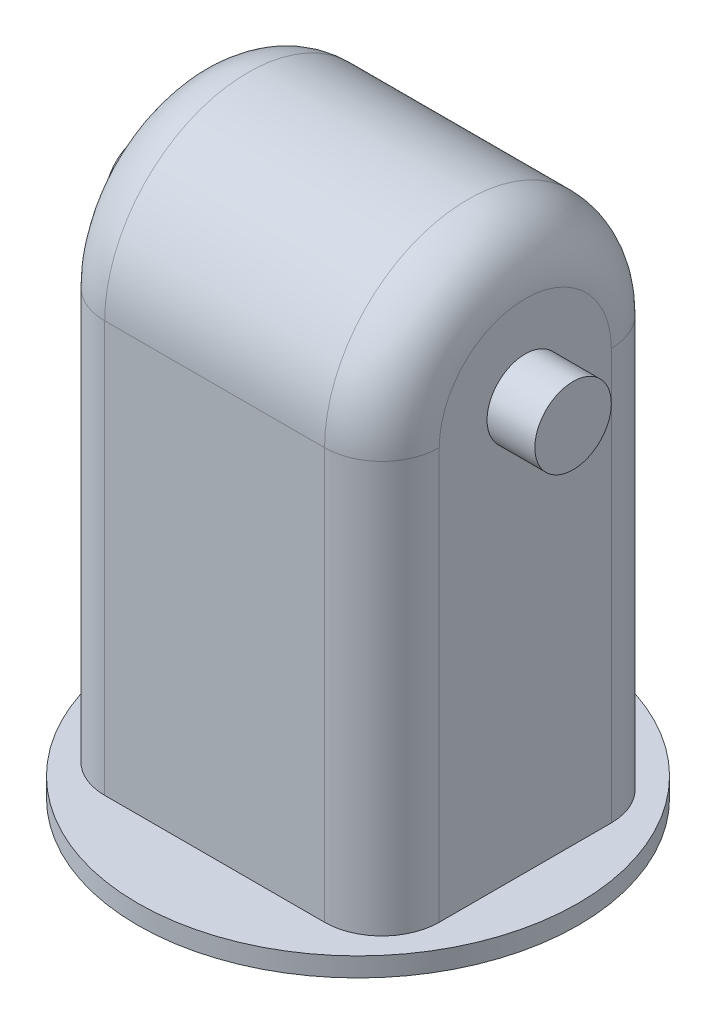
ISO-10303-21;
HEADER;
FILE_DESCRIPTION(('STEP AP214'),'2;1');
FILE_NAME('part.step','',(''),(''),'','','');
FILE_SCHEMA(('AUTOMOTIVE_DESIGN { 1 0 10303 214 1 1 1 1 }'));
ENDSEC;
DATA;
#1=APPLICATION_CONTEXT('core data for automotive mechanical design processes');
#2=APPLICATION_PROTOCOL_DEFINITION('international standard','automotive_design',2000,#1);
#3=PRODUCT_CONTEXT('',#1,'mechanical');
#4=PRODUCT('Part','Part','',(#3));
#5=PRODUCT_RELATED_PRODUCT_CATEGORY('part','',(#4));
#6=PRODUCT_DEFINITION_FORMATION('','',#4);
#7=PRODUCT_DEFINITION_CONTEXT('part definition',#1,'design');
#8=PRODUCT_DEFINITION('design','',#6,#7);
#9=PRODUCT_DEFINITION_SHAPE('','',#8);
#10=(LENGTH_UNIT() NAMED_UNIT(*) SI_UNIT(.MILLI.,.METRE.));
#11=(NAMED_UNIT(*) PLANE_ANGLE_UNIT() SI_UNIT($,.RADIAN.));
#12=(NAMED_UNIT(*) SI_UNIT($,.STERADIAN.) SOLID_ANGLE_UNIT());
#13=UNCERTAINTY_MEASURE_WITH_UNIT(LENGTH_MEASURE(1.E-05),#10,'distance_accuracy_value','');
#14=(GEOMETRIC_REPRESENTATION_CONTEXT(3) GLOBAL_UNCERTAINTY_ASSIGNED_CONTEXT((#13)) GLOBAL_UNIT_ASSIGNED_CONTEXT((#10,
#11,#12)) REPRESENTATION_CONTEXT('',''));
#15=CARTESIAN_POINT('',(0.,0.,0.));
#16=DIRECTION('',(0.,0.,1.));
#17=DIRECTION('',(1.,0.,0.));
#18=AXIS2_PLACEMENT_3D('',#15,#16,#17);
#19=CARTESIAN_POINT('',(17.5,45.,0.));
#20=DIRECTION('',(1.,0.,0.));
#21=DIRECTION('',(0.,0.,-1.));
#22=AXIS2_PLACEMENT_3D('',#19,#20,#21);
#23=CYLINDRICAL_SURFACE('',#22,15.);
#24=DIRECTION('',(1.,0.,0.));
#25=VECTOR('',#24,1.);
#26=CARTESIAN_POINT('',(-17.5,45.,-15.));
#27=LINE('',#26,#25);
#28=CARTESIAN_POINT('',(-11.5,45.,-15.));
#29=VERTEX_POINT('',#28);
#30=CARTESIAN_POINT('',(11.5,45.,-15.));
#31=VERTEX_POINT('',#30);
#32=EDGE_CURVE('E157',#29,#31,#27,.T.);
#33=ORIENTED_EDGE('',*,*,#32,.F.);
#34=CARTESIAN_POINT('',(-11.5,45.,0.));
#35=DIRECTION('',(1.,0.,0.));
#36=DIRECTION('',(0.,0.,-1.));
#37=AXIS2_PLACEMENT_3D('',#34,#35,#36);
#38=CIRCLE('',#37,15.);
#39=CARTESIAN_POINT('',(-11.5,45.,15.));
#40=VERTEX_POINT('',#39);
#41=EDGE_CURVE('E169',#29,#40,#38,.T.);
#42=ORIENTED_EDGE('',*,*,#41,.T.);
#43=DIRECTION('',(1.,0.,0.));
#44=VECTOR('',#43,1.);
#45=CARTESIAN_POINT('',(-17.5,45.,15.));
#46=LINE('',#45,#44);
#47=CARTESIAN_POINT('',(11.5,45.,15.));
#48=VERTEX_POINT('',#47);
#49=EDGE_CURVE('E154',#48,#40,#46,.F.);
#50=ORIENTED_EDGE('',*,*,#49,.F.);
#51=CARTESIAN_POINT('',(11.5,45.,0.));
#52=DIRECTION('',(-1.,0.,0.));
#53=DIRECTION('',(0.,0.,1.));
#54=AXIS2_PLACEMENT_3D('',#51,#52,#53);
#55=CIRCLE('',#54,15.);
#56=EDGE_CURVE('E167',#48,#31,#55,.T.);
#57=ORIENTED_EDGE('',*,*,#56,.T.);
#58=EDGE_LOOP('',(#33,#42,#50,#57));
#59=FACE_BOUND('',#58,.T.);
#60=ADVANCED_FACE('F36',(#59),#23,.T.);
#61=CARTESIAN_POINT('',(17.5,60.,15.));
#62=DIRECTION('',(-1.,0.,0.));
#63=DIRECTION('',(0.,0.,1.));
#64=AXIS2_PLACEMENT_3D('',#61,#62,#63);
#65=PLANE('',#64);
#66=CARTESIAN_POINT('',(17.5,45.,0.));
#67=DIRECTION('',(-1.,0.,0.));
#68=DIRECTION('',(0.,0.,1.));
#69=AXIS2_PLACEMENT_3D('',#66,#67,#68);
#70=CIRCLE('',#69,4.);
#71=CARTESIAN_POINT('',(17.5,45.,4.));
#72=VERTEX_POINT('',#71);
#73=EDGE_CURVE('E150',#72,#72,#70,.F.);
#74=ORIENTED_EDGE('',*,*,#73,.F.);
#75=EDGE_LOOP('',(#74));
#76=FACE_BOUND('',#75,.T.);
#77=DIRECTION('',(0.,0.,-1.));
#78=VECTOR('',#77,1.);
#79=CARTESIAN_POINT('',(17.5,2.,15.));
#80=LINE('',#79,#78);
#81=CARTESIAN_POINT('',(17.5,2.,9.));
#82=VERTEX_POINT('',#81);
#83=CARTESIAN_POINT('',(17.5,2.,-9.));
#84=VERTEX_POINT('',#83);
#85=EDGE_CURVE('E139',#82,#84,#80,.T.);
#86=ORIENTED_EDGE('',*,*,#85,.T.);
#87=DIRECTION('',(0.,-1.,0.));
#88=VECTOR('',#87,1.);
#89=CARTESIAN_POINT('',(17.5,60.,-9.));
#90=LINE('',#89,#88);
#91=CARTESIAN_POINT('',(17.5,45.,-9.));
#92=VERTEX_POINT('',#91);
#93=EDGE_CURVE('E176',#84,#92,#90,.F.);
#94=ORIENTED_EDGE('',*,*,#93,.T.);
#95=CARTESIAN_POINT('',(17.5,45.,0.));
#96=DIRECTION('',(-1.,0.,0.));
#97=DIRECTION('',(0.,0.,1.));
#98=AXIS2_PLACEMENT_3D('',#95,#96,#97);
#99=CIRCLE('',#98,9.);
#100=CARTESIAN_POINT('',(17.5,45.,9.));
#101=VERTEX_POINT('',#100);
#102=EDGE_CURVE('E173',#92,#101,#99,.F.);
#103=ORIENTED_EDGE('',*,*,#102,.T.);
#104=DIRECTION('',(0.,-1.,0.));
#105=VECTOR('',#104,1.);
#106=CARTESIAN_POINT('',(17.5,60.,9.));
#107=LINE('',#106,#105);
#108=EDGE_CURVE('E171',#101,#82,#107,.T.);
#109=ORIENTED_EDGE('',*,*,#108,.T.);
#110=EDGE_LOOP('',(#86,#94,#103,#109));
#111=FACE_BOUND('',#110,.T.);
#112=ADVANCED_FACE('F232',(#76,#111),#65,.F.);
#113=CARTESIAN_POINT('',(-17.5,60.,-15.));
#114=DIRECTION('',(0.,0.,1.));
#115=DIRECTION('',(1.,0.,0.));
#116=AXIS2_PLACEMENT_3D('',#113,#114,#115);
#117=PLANE('',#116);
#118=ORIENTED_EDGE('',*,*,#32,.T.);
#119=DIRECTION('',(0.,-1.,0.));
#120=VECTOR('',#119,1.);
#121=CARTESIAN_POINT('',(11.5,60.,-15.));
#122=LINE('',#121,#120);
#123=CARTESIAN_POINT('',(11.5,2.,-15.));
#124=VERTEX_POINT('',#123);
#125=EDGE_CURVE('E180',#31,#124,#122,.T.);
#126=ORIENTED_EDGE('',*,*,#125,.T.);
#127=DIRECTION('',(-1.,0.,0.));
#128=VECTOR('',#127,1.);
#129=CARTESIAN_POINT('',(-17.5,2.,-15.));
#130=LINE('',#129,#128);
#131=CARTESIAN_POINT('',(-11.5,2.,-15.));
#132=VERTEX_POINT('',#131);
#133=EDGE_CURVE('E126',#124,#132,#130,.T.);
#134=ORIENTED_EDGE('',*,*,#133,.T.);
#135=DIRECTION('',(0.,-1.,0.));
#136=VECTOR('',#135,1.);
#137=CARTESIAN_POINT('',(-11.5,60.,-15.));
#138=LINE('',#137,#136);
#139=EDGE_CURVE('E178',#132,#29,#138,.F.);
#140=ORIENTED_EDGE('',*,*,#139,.T.);
#141=EDGE_LOOP('',(#118,#126,#134,#140));
#142=FACE_BOUND('',#141,.T.);
#143=ADVANCED_FACE('F238',(#142),#117,.F.);
#144=CARTESIAN_POINT('',(-17.5,60.,15.));
#145=DIRECTION('',(1.,0.,0.));
#146=DIRECTION('',(0.,0.,-1.));
#147=AXIS2_PLACEMENT_3D('',#144,#145,#146);
#148=PLANE('',#147);
#149=CARTESIAN_POINT('',(-17.5,45.,0.));
#150=DIRECTION('',(1.,0.,0.));
#151=DIRECTION('',(0.,0.,-1.));
#152=AXIS2_PLACEMENT_3D('',#149,#150,#151);
#153=CIRCLE('',#152,4.);
#154=CARTESIAN_POINT('',(-17.5,45.,-4.));
#155=VERTEX_POINT('',#154);
#156=EDGE_CURVE('E141',#155,#155,#153,.T.);
#157=ORIENTED_EDGE('',*,*,#156,.T.);
#158=EDGE_LOOP('',(#157));
#159=FACE_BOUND('',#158,.T.);
#160=CARTESIAN_POINT('',(-17.5,45.,0.));
#161=DIRECTION('',(1.,0.,0.));
#162=DIRECTION('',(0.,0.,-1.));
#163=AXIS2_PLACEMENT_3D('',#160,#161,#162);
#164=CIRCLE('',#163,9.);
#165=CARTESIAN_POINT('',(-17.5,45.,9.));
#166=VERTEX_POINT('',#165);
#167=CARTESIAN_POINT('',(-17.5,45.,-9.));
#168=VERTEX_POINT('',#167);
#169=EDGE_CURVE('E162',#166,#168,#164,.F.);
#170=ORIENTED_EDGE('',*,*,#169,.T.);
#171=DIRECTION('',(0.,-1.,0.));
#172=VECTOR('',#171,1.);
#173=CARTESIAN_POINT('',(-17.5,60.,-9.));
#174=LINE('',#173,#172);
#175=CARTESIAN_POINT('',(-17.5,2.,-9.));
#176=VERTEX_POINT('',#175);
#177=EDGE_CURVE('E165',#168,#176,#174,.T.);
#178=ORIENTED_EDGE('',*,*,#177,.T.);
#179=DIRECTION('',(0.,0.,1.));
#180=VECTOR('',#179,1.);
#181=CARTESIAN_POINT('',(-17.5,2.,15.));
#182=LINE('',#181,#180);
#183=CARTESIAN_POINT('',(-17.5,2.,9.));
#184=VERTEX_POINT('',#183);
#185=EDGE_CURVE('E61',#176,#184,#182,.T.);
#186=ORIENTED_EDGE('',*,*,#185,.T.);
#187=DIRECTION('',(0.,-1.,0.));
#188=VECTOR('',#187,1.);
#189=CARTESIAN_POINT('',(-17.5,60.,9.));
#190=LINE('',#189,#188);
#191=EDGE_CURVE('E160',#184,#166,#190,.F.);
#192=ORIENTED_EDGE('',*,*,#191,.T.);
#193=EDGE_LOOP('',(#170,#178,#186,#192));
#194=FACE_BOUND('',#193,.T.);
#195=ADVANCED_FACE('F286',(#159,#194),#148,.F.);
#196=CARTESIAN_POINT('',(-17.5,60.,15.));
#197=DIRECTION('',(0.,0.,-1.));
#198=DIRECTION('',(-1.,0.,0.));
#199=AXIS2_PLACEMENT_3D('',#196,#197,#198);
#200=PLANE('',#199);
#201=ORIENTED_EDGE('',*,*,#49,.T.);
#202=DIRECTION('',(0.,-1.,0.));
#203=VECTOR('',#202,1.);
#204=CARTESIAN_POINT('',(-11.5,60.,15.));
#205=LINE('',#204,#203);
#206=CARTESIAN_POINT('',(-11.5,2.,15.));
#207=VERTEX_POINT('',#206);
#208=EDGE_CURVE('E184',#40,#207,#205,.T.);
#209=ORIENTED_EDGE('',*,*,#208,.T.);
#210=DIRECTION('',(1.,0.,0.));
#211=VECTOR('',#210,1.);
#212=CARTESIAN_POINT('',(-17.5,2.,15.));
#213=LINE('',#212,#211);
#214=CARTESIAN_POINT('',(11.5,2.,15.));
#215=VERTEX_POINT('',#214);
#216=EDGE_CURVE('E53',#207,#215,#213,.T.);
#217=ORIENTED_EDGE('',*,*,#216,.T.);
#218=DIRECTION('',(0.,-1.,0.));
#219=VECTOR('',#218,1.);
#220=CARTESIAN_POINT('',(11.5,60.,15.));
#221=LINE('',#220,#219);
#222=EDGE_CURVE('E182',#215,#48,#221,.F.);
#223=ORIENTED_EDGE('',*,*,#222,.T.);
#224=EDGE_LOOP('',(#201,#209,#217,#223));
#225=FACE_BOUND('',#224,.T.);
#226=ADVANCED_FACE('F283',(#225),#200,.F.);
#227=CARTESIAN_POINT('',(22.5,45.,0.));
#228=DIRECTION('',(-1.,0.,0.));
#229=DIRECTION('',(0.,0.,1.));
#230=AXIS2_PLACEMENT_3D('',#227,#228,#229);
#231=CYLINDRICAL_SURFACE('',#230,4.);
#232=CARTESIAN_POINT('',(22.5,45.,0.));
#233=DIRECTION('',(1.,0.,0.));
#234=DIRECTION('',(0.,0.,-1.));
#235=AXIS2_PLACEMENT_3D('',#232,#233,#234);
#236=CIRCLE('',#235,4.);
#237=CARTESIAN_POINT('',(22.5,45.,-4.));
#238=VERTEX_POINT('',#237);
#239=EDGE_CURVE('E145',#238,#238,#236,.T.);
#240=ORIENTED_EDGE('',*,*,#239,.F.);
#241=EDGE_LOOP('',(#240));
#242=FACE_BOUND('',#241,.T.);
#243=ORIENTED_EDGE('',*,*,#73,.T.);
#244=EDGE_LOOP('',(#243));
#245=FACE_BOUND('',#244,.T.);
#246=ADVANCED_FACE('F285',(#242,#245),#231,.T.);
#247=CARTESIAN_POINT('',(22.5,45.,0.));
#248=DIRECTION('',(1.,0.,0.));
#249=DIRECTION('',(0.,0.,-1.));
#250=AXIS2_PLACEMENT_3D('',#247,#248,#249);
#251=PLANE('',#250);
#252=ORIENTED_EDGE('',*,*,#239,.T.);
#253=EDGE_LOOP('',(#252));
#254=FACE_BOUND('',#253,.T.);
#255=ADVANCED_FACE('F291',(#254),#251,.T.);
#256=CARTESIAN_POINT('',(-22.5,45.,0.));
#257=DIRECTION('',(1.,0.,0.));
#258=DIRECTION('',(0.,0.,-1.));
#259=AXIS2_PLACEMENT_3D('',#256,#257,#258);
#260=CYLINDRICAL_SURFACE('',#259,4.);
#261=CARTESIAN_POINT('',(-22.5,45.,0.));
#262=DIRECTION('',(1.,0.,0.));
#263=DIRECTION('',(0.,0.,-1.));
#264=AXIS2_PLACEMENT_3D('',#261,#262,#263);
#265=CIRCLE('',#264,4.);
#266=CARTESIAN_POINT('',(-22.5,45.,-4.));
#267=VERTEX_POINT('',#266);
#268=EDGE_CURVE('E142',#267,#267,#265,.T.);
#269=ORIENTED_EDGE('',*,*,#268,.T.);
#270=EDGE_LOOP('',(#269));
#271=FACE_BOUND('',#270,.T.);
#272=ORIENTED_EDGE('',*,*,#156,.F.);
#273=EDGE_LOOP('',(#272));
#274=FACE_BOUND('',#273,.T.);
#275=ADVANCED_FACE('F380',(#271,#274),#260,.T.);
#276=CARTESIAN_POINT('',(-22.5,45.,0.));
#277=DIRECTION('',(-1.,0.,0.));
#278=DIRECTION('',(0.,0.,-1.));
#279=AXIS2_PLACEMENT_3D('',#276,#277,#278);
#280=PLANE('',#279);
#281=ORIENTED_EDGE('',*,*,#268,.F.);
#282=EDGE_LOOP('',(#281));
#283=FACE_BOUND('',#282,.T.);
#284=ADVANCED_FACE('F318',(#283),#280,.T.);
#285=CARTESIAN_POINT('',(0.,2.,0.));
#286=DIRECTION('',(0.,1.,0.));
#287=DIRECTION('',(0.,0.,1.));
#288=AXIS2_PLACEMENT_3D('',#285,#286,#287);
#289=PLANE('',#288);
#290=CARTESIAN_POINT('',(0.,2.,0.));
#291=DIRECTION('',(0.,1.,0.));
#292=DIRECTION('',(0.,0.,1.));
#293=AXIS2_PLACEMENT_3D('',#290,#291,#292);
#294=CIRCLE('',#293,23.0488611432322);
#295=CARTESIAN_POINT('',(-17.5,2.,15.));
#296=VERTEX_POINT('',#295);
#297=CARTESIAN_POINT('',(17.5,2.,15.));
#298=VERTEX_POINT('',#297);
#299=EDGE_CURVE('E125',#296,#298,#294,.T.);
#300=ORIENTED_EDGE('',*,*,#299,.T.);
#301=CARTESIAN_POINT('',(17.5,2.,-15.));
#302=VERTEX_POINT('',#301);
#303=EDGE_CURVE('E117',#298,#302,#294,.T.);
#304=ORIENTED_EDGE('',*,*,#303,.T.);
#305=CARTESIAN_POINT('',(-17.5,2.,-15.));
#306=VERTEX_POINT('',#305);
#307=EDGE_CURVE('E114',#302,#306,#294,.T.);
#308=ORIENTED_EDGE('',*,*,#307,.T.);
#309=EDGE_CURVE('E120',#306,#296,#294,.T.);
#310=ORIENTED_EDGE('',*,*,#309,.T.);
#311=EDGE_LOOP('',(#300,#304,#308,#310));
#312=FACE_BOUND('',#311,.T.);
#313=ORIENTED_EDGE('',*,*,#216,.F.);
#314=CARTESIAN_POINT('',(-11.5,2.,9.));
#315=DIRECTION('',(0.,1.,0.));
#316=DIRECTION('',(0.,0.,1.));
#317=AXIS2_PLACEMENT_3D('',#314,#315,#316);
#318=CIRCLE('',#317,6.);
#319=EDGE_CURVE('E192',#207,#184,#318,.F.);
#320=ORIENTED_EDGE('',*,*,#319,.T.);
#321=ORIENTED_EDGE('',*,*,#185,.F.);
#322=CARTESIAN_POINT('',(-11.5,2.,-9.));
#323=DIRECTION('',(0.,1.,0.));
#324=DIRECTION('',(0.,0.,1.));
#325=AXIS2_PLACEMENT_3D('',#322,#323,#324);
#326=CIRCLE('',#325,6.);
#327=EDGE_CURVE('E189',#176,#132,#326,.F.);
#328=ORIENTED_EDGE('',*,*,#327,.T.);
#329=ORIENTED_EDGE('',*,*,#133,.F.);
#330=CARTESIAN_POINT('',(11.5,2.,-9.));
#331=DIRECTION('',(0.,1.,0.));
#332=DIRECTION('',(0.,0.,1.));
#333=AXIS2_PLACEMENT_3D('',#330,#331,#332);
#334=CIRCLE('',#333,6.);
#335=EDGE_CURVE('E186',#124,#84,#334,.F.);
#336=ORIENTED_EDGE('',*,*,#335,.T.);
#337=ORIENTED_EDGE('',*,*,#85,.F.);
#338=CARTESIAN_POINT('',(11.5,2.,9.));
#339=DIRECTION('',(0.,1.,0.));
#340=DIRECTION('',(0.,0.,1.));
#341=AXIS2_PLACEMENT_3D('',#338,#339,#340);
#342=CIRCLE('',#341,6.);
#343=EDGE_CURVE('E45',#82,#215,#342,.F.);
#344=ORIENTED_EDGE('',*,*,#343,.T.);
#345=EDGE_LOOP('',(#313,#320,#321,#328,#329,#336,#337,#344));
#346=FACE_BOUND('',#345,.T.);
#347=ADVANCED_FACE('F123',(#312,#346),#289,.T.);
#348=CARTESIAN_POINT('',(0.,2.,0.));
#349=DIRECTION('',(0.,-1.,0.));
#350=DIRECTION('',(0.,0.,-1.));
#351=AXIS2_PLACEMENT_3D('',#348,#349,#350);
#352=CYLINDRICAL_SURFACE('',#351,23.0488611432322);
#353=CARTESIAN_POINT('',(0.,0.,0.));
#354=DIRECTION('',(0.,1.,0.));
#355=DIRECTION('',(0.,0.,1.));
#356=AXIS2_PLACEMENT_3D('',#353,#354,#355);
#357=CIRCLE('',#356,23.0488611432322);
#358=CARTESIAN_POINT('',(0.,0.,23.0488611432322));
#359=VERTEX_POINT('',#358);
#360=EDGE_CURVE('E129',#359,#359,#357,.T.);
#361=ORIENTED_EDGE('',*,*,#360,.T.);
#362=EDGE_LOOP('',(#361));
#363=FACE_BOUND('',#362,.T.);
#364=ORIENTED_EDGE('',*,*,#307,.F.);
#365=ORIENTED_EDGE('',*,*,#303,.F.);
#366=ORIENTED_EDGE('',*,*,#299,.F.);
#367=ORIENTED_EDGE('',*,*,#309,.F.);
#368=EDGE_LOOP('',(#364,#365,#366,#367));
#369=FACE_BOUND('',#368,.T.);
#370=ADVANCED_FACE('F116',(#363,#369),#352,.T.);
#371=CARTESIAN_POINT('',(0.,0.,0.));
#372=DIRECTION('',(0.,-1.,0.));
#373=DIRECTION('',(0.,0.,-1.));
#374=AXIS2_PLACEMENT_3D('',#371,#372,#373);
#375=PLANE('',#374);
#376=CARTESIAN_POINT('',(0.,0.,0.));
#377=DIRECTION('',(0.,-1.,0.));
#378=DIRECTION('',(0.,0.,-1.));
#379=AXIS2_PLACEMENT_3D('',#376,#377,#378);
#380=CIRCLE('',#379,5.);
#381=CARTESIAN_POINT('',(0.,0.,-5.));
#382=VERTEX_POINT('',#381);
#383=EDGE_CURVE('E11',#382,#382,#380,.T.);
#384=ORIENTED_EDGE('',*,*,#383,.F.);
#385=EDGE_LOOP('',(#384));
#386=FACE_BOUND('',#385,.T.);
#387=ORIENTED_EDGE('',*,*,#360,.F.);
#388=EDGE_LOOP('',(#387));
#389=FACE_BOUND('',#388,.T.);
#390=ADVANCED_FACE('F216',(#386,#389),#375,.T.);
#391=CARTESIAN_POINT('',(-11.5,60.,9.));
#392=DIRECTION('',(0.,-1.,0.));
#393=DIRECTION('',(0.,0.,-1.));
#394=AXIS2_PLACEMENT_3D('',#391,#392,#393);
#395=CYLINDRICAL_SURFACE('',#394,6.);
#396=ORIENTED_EDGE('',*,*,#319,.F.);
#397=ORIENTED_EDGE('',*,*,#208,.F.);
#398=CARTESIAN_POINT('',(-11.5,45.,9.));
#399=DIRECTION('',(0.,1.,0.));
#400=DIRECTION('',(0.,0.,1.));
#401=AXIS2_PLACEMENT_3D('',#398,#399,#400);
#402=CIRCLE('',#401,6.);
#403=EDGE_CURVE('E131',#166,#40,#402,.T.);
#404=ORIENTED_EDGE('',*,*,#403,.F.);
#405=ORIENTED_EDGE('',*,*,#191,.F.);
#406=EDGE_LOOP('',(#396,#397,#404,#405));
#407=FACE_BOUND('',#406,.T.);
#408=ADVANCED_FACE('F219',(#407),#395,.T.);
#409=CARTESIAN_POINT('',(-11.5,60.,-9.));
#410=DIRECTION('',(0.,-1.,0.));
#411=DIRECTION('',(0.,0.,-1.));
#412=AXIS2_PLACEMENT_3D('',#409,#410,#411);
#413=CYLINDRICAL_SURFACE('',#412,6.);
#414=ORIENTED_EDGE('',*,*,#327,.F.);
#415=ORIENTED_EDGE('',*,*,#177,.F.);
#416=CARTESIAN_POINT('',(-11.5,45.,-9.));
#417=DIRECTION('',(0.,1.,0.));
#418=DIRECTION('',(0.,0.,1.));
#419=AXIS2_PLACEMENT_3D('',#416,#417,#418);
#420=CIRCLE('',#419,6.);
#421=EDGE_CURVE('E135',#29,#168,#420,.T.);
#422=ORIENTED_EDGE('',*,*,#421,.F.);
#423=ORIENTED_EDGE('',*,*,#139,.F.);
#424=EDGE_LOOP('',(#414,#415,#422,#423));
#425=FACE_BOUND('',#424,.T.);
#426=ADVANCED_FACE('F225',(#425),#413,.T.);
#427=CARTESIAN_POINT('',(-11.5,45.,0.));
#428=DIRECTION('',(1.,0.,0.));
#429=DIRECTION('',(0.,0.,-1.));
#430=AXIS2_PLACEMENT_3D('',#427,#428,#429);
#431=TOROIDAL_SURFACE('',#430,9.,6.);
#432=ORIENTED_EDGE('',*,*,#403,.T.);
#433=ORIENTED_EDGE('',*,*,#41,.F.);
#434=ORIENTED_EDGE('',*,*,#421,.T.);
#435=ORIENTED_EDGE('',*,*,#169,.F.);
#436=EDGE_LOOP('',(#432,#433,#434,#435));
#437=FACE_BOUND('',#436,.T.);
#438=ADVANCED_FACE('F247',(#437),#431,.T.);
#439=CARTESIAN_POINT('',(11.5,60.,-9.));
#440=DIRECTION('',(0.,-1.,0.));
#441=DIRECTION('',(0.,0.,-1.));
#442=AXIS2_PLACEMENT_3D('',#439,#440,#441);
#443=CYLINDRICAL_SURFACE('',#442,6.);
#444=ORIENTED_EDGE('',*,*,#335,.F.);
#445=ORIENTED_EDGE('',*,*,#125,.F.);
#446=CARTESIAN_POINT('',(11.5,45.,-9.));
#447=DIRECTION('',(0.,1.,0.));
#448=DIRECTION('',(0.,0.,1.));
#449=AXIS2_PLACEMENT_3D('',#446,#447,#448);
#450=CIRCLE('',#449,6.);
#451=EDGE_CURVE('E40',#92,#31,#450,.T.);
#452=ORIENTED_EDGE('',*,*,#451,.F.);
#453=ORIENTED_EDGE('',*,*,#93,.F.);
#454=EDGE_LOOP('',(#444,#445,#452,#453));
#455=FACE_BOUND('',#454,.T.);
#456=ADVANCED_FACE('F38',(#455),#443,.T.);
#457=CARTESIAN_POINT('',(11.5,60.,9.));
#458=DIRECTION('',(0.,-1.,0.));
#459=DIRECTION('',(0.,0.,-1.));
#460=AXIS2_PLACEMENT_3D('',#457,#458,#459);
#461=CYLINDRICAL_SURFACE('',#460,6.);
#462=ORIENTED_EDGE('',*,*,#343,.F.);
#463=ORIENTED_EDGE('',*,*,#108,.F.);
#464=CARTESIAN_POINT('',(11.5,45.,9.));
#465=DIRECTION('',(0.,1.,0.));
#466=DIRECTION('',(0.,0.,1.));
#467=AXIS2_PLACEMENT_3D('',#464,#465,#466);
#468=CIRCLE('',#467,6.);
#469=EDGE_CURVE('E195',#48,#101,#468,.T.);
#470=ORIENTED_EDGE('',*,*,#469,.F.);
#471=ORIENTED_EDGE('',*,*,#222,.F.);
#472=EDGE_LOOP('',(#462,#463,#470,#471));
#473=FACE_BOUND('',#472,.T.);
#474=ADVANCED_FACE('F255',(#473),#461,.T.);
#475=CARTESIAN_POINT('',(11.5,45.,0.));
#476=DIRECTION('',(-1.,0.,0.));
#477=DIRECTION('',(0.,0.,1.));
#478=AXIS2_PLACEMENT_3D('',#475,#476,#477);
#479=TOROIDAL_SURFACE('',#478,9.,6.);
#480=ORIENTED_EDGE('',*,*,#451,.T.);
#481=ORIENTED_EDGE('',*,*,#56,.F.);
#482=ORIENTED_EDGE('',*,*,#469,.T.);
#483=ORIENTED_EDGE('',*,*,#102,.F.);
#484=EDGE_LOOP('',(#480,#481,#482,#483));
#485=FACE_BOUND('',#484,.T.);
#486=ADVANCED_FACE('F212',(#485),#479,.T.);
#487=CARTESIAN_POINT('',(0.,-1.,0.));
#488=DIRECTION('',(0.,1.,0.));
#489=DIRECTION('',(0.,0.,1.));
#490=AXIS2_PLACEMENT_3D('',#487,#488,#489);
#491=CYLINDRICAL_SURFACE('',#490,5.);
#492=CARTESIAN_POINT('',(0.,-1.,0.));
#493=DIRECTION('',(0.,-1.,0.));
#494=DIRECTION('',(0.,0.,-1.));
#495=AXIS2_PLACEMENT_3D('',#492,#493,#494);
#496=CIRCLE('',#495,5.);
#497=CARTESIAN_POINT('',(0.,-1.,-5.));
#498=VERTEX_POINT('',#497);
#499=EDGE_CURVE('E196',#498,#498,#496,.T.);
#500=ORIENTED_EDGE('',*,*,#499,.F.);
#501=EDGE_LOOP('',(#500));
#502=FACE_BOUND('',#501,.T.);
#503=ORIENTED_EDGE('',*,*,#383,.T.);
#504=EDGE_LOOP('',(#503));
#505=FACE_BOUND('',#504,.T.);
#506=ADVANCED_FACE('F209',(#502,#505),#491,.T.);
#507=CARTESIAN_POINT('',(0.,-1.,0.));
#508=DIRECTION('',(0.,-1.,0.));
#509=DIRECTION('',(0.,0.,-1.));
#510=AXIS2_PLACEMENT_3D('',#507,#508,#509);
#511=PLANE('',#510);
#512=ORIENTED_EDGE('',*,*,#499,.T.);
#513=EDGE_LOOP('',(#512));
#514=FACE_BOUND('',#513,.T.);
#515=ADVANCED_FACE('F207',(#514),#511,.T.);
#516=CLOSED_SHELL('',(#60,#112,#143,#195,#226,#246,#255,#275,#284,#347,#370,#390,#408,#426,#438,
#456,#474,#486,#506,#515));
#517=MANIFOLD_SOLID_BREP('B2',#516);
#518=ADVANCED_BREP_SHAPE_REPRESENTATION('',(#18,#517),#14);
#519=SHAPE_DEFINITION_REPRESENTATION(#9,#518);
ENDSEC;
END-ISO-10303-21;
